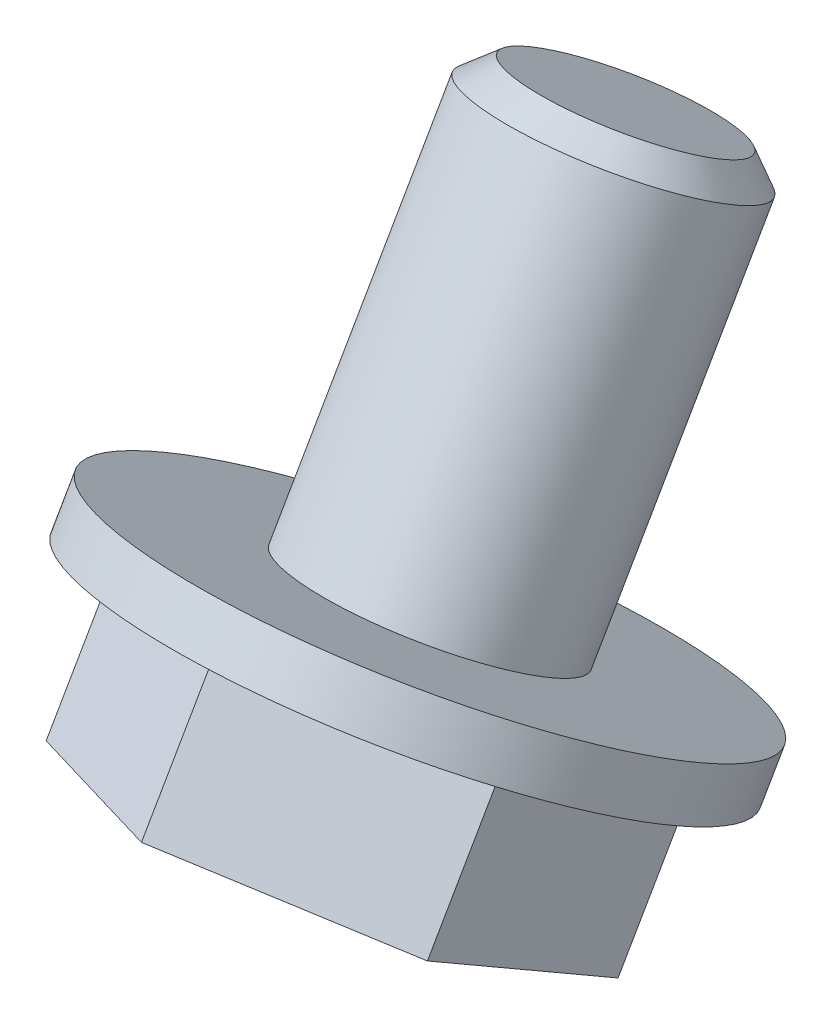
ISO-10303-21;
HEADER;
FILE_DESCRIPTION(('STEP AP214'),'2;1');
FILE_NAME('part.step','',(''),(''),'','','');
FILE_SCHEMA(('AUTOMOTIVE_DESIGN { 1 0 10303 214 1 1 1 1 }'));
ENDSEC;
DATA;
#1=APPLICATION_CONTEXT('core data for automotive mechanical design processes');
#2=APPLICATION_PROTOCOL_DEFINITION('international standard','automotive_design',2000,#1);
#3=PRODUCT_CONTEXT('',#1,'mechanical');
#4=PRODUCT('Part','Part','',(#3));
#5=PRODUCT_RELATED_PRODUCT_CATEGORY('part','',(#4));
#6=PRODUCT_DEFINITION_FORMATION('','',#4);
#7=PRODUCT_DEFINITION_CONTEXT('part definition',#1,'design');
#8=PRODUCT_DEFINITION('design','',#6,#7);
#9=PRODUCT_DEFINITION_SHAPE('','',#8);
#10=(LENGTH_UNIT() NAMED_UNIT(*) SI_UNIT(.MILLI.,.METRE.));
#11=(NAMED_UNIT(*) PLANE_ANGLE_UNIT() SI_UNIT($,.RADIAN.));
#12=(NAMED_UNIT(*) SI_UNIT($,.STERADIAN.) SOLID_ANGLE_UNIT());
#13=UNCERTAINTY_MEASURE_WITH_UNIT(LENGTH_MEASURE(1.E-05),#10,'distance_accuracy_value','');
#14=(GEOMETRIC_REPRESENTATION_CONTEXT(3) GLOBAL_UNCERTAINTY_ASSIGNED_CONTEXT((#13)) GLOBAL_UNIT_ASSIGNED_CONTEXT((#10,
#11,#12)) REPRESENTATION_CONTEXT('',''));
#15=CARTESIAN_POINT('',(0.,0.,0.));
#16=DIRECTION('',(0.,0.,1.));
#17=DIRECTION('',(1.,0.,0.));
#18=AXIS2_PLACEMENT_3D('',#15,#16,#17);
#19=CARTESIAN_POINT('',(-174.8681312178,-57.88145863115,30.14791531431));
#20=DIRECTION('',(0.,-0.866025403783768,0.500000000001161));
#21=DIRECTION('',(0.,0.500000000001161,0.866025403783768));
#22=AXIS2_PLACEMENT_3D('',#19,#20,#21);
#23=PLANE('',#22);
#24=DIRECTION('',(-1.,0.,0.));
#25=VECTOR('',#24,1.);
#26=CARTESIAN_POINT('',(-179.51530050145,-56.0116991146615,33.38643379479));
#27=LINE('',#26,#25);
#28=CARTESIAN_POINT('',(-178.60765025071,-56.0116991146643,33.3864337947881));
#29=VERTEX_POINT('',#28);
#30=CARTESIAN_POINT('',(-180.422950752151,-56.011699114664,33.386433794788));
#31=VERTEX_POINT('',#30);
#32=EDGE_CURVE('E167',#29,#31,#27,.T.);
#33=ORIENTED_EDGE('',*,*,#32,.T.);
#34=DIRECTION('',(0.,-0.500000000000399,-0.866025403784209));
#35=VECTOR('',#34,1.);
#36=CARTESIAN_POINT('',(-180.4229507522,-56.4655242400263,32.60038561991));
#37=LINE('',#36,#35);
#38=CARTESIAN_POINT('',(-180.422950752151,-56.9193493653849,31.8143374450396));
#39=VERTEX_POINT('',#38);
#40=EDGE_CURVE('E149',#31,#39,#37,.T.);
#41=ORIENTED_EDGE('',*,*,#40,.T.);
#42=DIRECTION('',(1.,0.,0.));
#43=VECTOR('',#42,1.);
#44=CARTESIAN_POINT('',(-179.51530050145,-56.9193493653813,31.81433744504));
#45=LINE('',#44,#43);
#46=CARTESIAN_POINT('',(-178.607650250716,-56.9193493653835,31.8143374450392));
#47=VERTEX_POINT('',#46);
#48=EDGE_CURVE('E155',#39,#47,#45,.T.);
#49=ORIENTED_EDGE('',*,*,#48,.T.);
#50=DIRECTION('',(0.,-0.500000000002688,-0.866025403782887));
#51=VECTOR('',#50,1.);
#52=CARTESIAN_POINT('',(-178.6076502507,-57.3731744907464,31.028289270165));
#53=LINE('',#52,#51);
#54=CARTESIAN_POINT('',(-178.607650250696,-57.8269996161055,30.2422410952936));
#55=VERTEX_POINT('',#54);
#56=EDGE_CURVE('E272',#47,#55,#53,.T.);
#57=ORIENTED_EDGE('',*,*,#56,.T.);
#58=DIRECTION('',(1.,0.,0.));
#59=VECTOR('',#58,1.);
#60=CARTESIAN_POINT('',(-177.7,-57.8269996161013,30.24224109529));
#61=LINE('',#60,#59);
#62=CARTESIAN_POINT('',(-176.792349749304,-57.8269996161055,30.2422410952936));
#63=VERTEX_POINT('',#62);
#64=EDGE_CURVE('E278',#55,#63,#61,.T.);
#65=ORIENTED_EDGE('',*,*,#64,.T.);
#66=DIRECTION('',(0.,0.500000000002688,0.866025403782887));
#67=VECTOR('',#66,1.);
#68=CARTESIAN_POINT('',(-176.7923497493,-57.3731744907464,31.028289270165));
#69=LINE('',#68,#67);
#70=CARTESIAN_POINT('',(-176.79234974929,-56.9193493653846,31.8143374450395));
#71=VERTEX_POINT('',#70);
#72=EDGE_CURVE('E284',#63,#71,#69,.T.);
#73=ORIENTED_EDGE('',*,*,#72,.T.);
#74=DIRECTION('',(1.,0.,0.));
#75=VECTOR('',#74,1.);
#76=CARTESIAN_POINT('',(-175.88469949855,-56.9193493653813,31.81433744504));
#77=LINE('',#76,#75);
#78=CARTESIAN_POINT('',(-174.97704924785,-56.9193493653849,31.8143374450395));
#79=VERTEX_POINT('',#78);
#80=EDGE_CURVE('E290',#71,#79,#77,.T.);
#81=ORIENTED_EDGE('',*,*,#80,.T.);
#82=DIRECTION('',(0.,0.500000000000399,0.866025403784209));
#83=VECTOR('',#82,1.);
#84=CARTESIAN_POINT('',(-174.9770492478,-56.4655242400263,32.60038561991));
#85=LINE('',#84,#83);
#86=CARTESIAN_POINT('',(-174.97704924785,-56.011699114664,33.3864337947879));
#87=VERTEX_POINT('',#86);
#88=EDGE_CURVE('E296',#79,#87,#85,.T.);
#89=ORIENTED_EDGE('',*,*,#88,.T.);
#90=DIRECTION('',(-1.,0.,0.));
#91=VECTOR('',#90,1.);
#92=CARTESIAN_POINT('',(-175.88469949855,-56.0116991146615,33.38643379479));
#93=LINE('',#92,#91);
#94=CARTESIAN_POINT('',(-176.79234974929,-56.0116991146643,33.386433794788));
#95=VERTEX_POINT('',#94);
#96=EDGE_CURVE('E302',#87,#95,#93,.T.);
#97=ORIENTED_EDGE('',*,*,#96,.T.);
#98=DIRECTION('',(0.,0.500000000000403,0.866025403784206));
#99=VECTOR('',#98,1.);
#100=CARTESIAN_POINT('',(-176.7923497493,-55.5578739893064,34.17248196966));
#101=LINE('',#100,#99);
#102=CARTESIAN_POINT('',(-176.792349749304,-55.1040488639459,34.9585301445339));
#103=VERTEX_POINT('',#102);
#104=EDGE_CURVE('E308',#95,#103,#101,.T.);
#105=ORIENTED_EDGE('',*,*,#104,.T.);
#106=DIRECTION('',(-1.,0.,0.));
#107=VECTOR('',#106,1.);
#108=CARTESIAN_POINT('',(-177.7,-55.1040488639514,34.95853014453));
#109=LINE('',#108,#107);
#110=CARTESIAN_POINT('',(-178.607650250696,-55.1040488639459,34.958530144534));
#111=VERTEX_POINT('',#110);
#112=EDGE_CURVE('E314',#103,#111,#109,.T.);
#113=ORIENTED_EDGE('',*,*,#112,.T.);
#114=DIRECTION('',(0.,-0.500000000000403,-0.866025403784206));
#115=VECTOR('',#114,1.);
#116=CARTESIAN_POINT('',(-178.6076502507,-55.5578739893064,34.17248196966));
#117=LINE('',#116,#115);
#118=EDGE_CURVE('E320',#111,#29,#117,.T.);
#119=ORIENTED_EDGE('',*,*,#118,.T.);
#120=EDGE_LOOP('',(#33,#41,#49,#57,#65,#73,#81,#89,#97,#105,#113,#119));
#121=FACE_BOUND('',#120,.T.);
#122=ADVANCED_FACE('F17',(#121),#23,.T.);
#123=CARTESIAN_POINT('',(-180.4592567622,-56.88470834923,31.79433744504));
#124=DIRECTION('',(0.,-0.500000000000343,-0.866025403784241));
#125=DIRECTION('',(1.,0.,0.));
#126=AXIS2_PLACEMENT_3D('',#123,#124,#125);
#127=PLANE('',#126);
#128=ORIENTED_EDGE('',*,*,#48,.F.);
#129=DIRECTION('',(0.,-0.866025403784242,0.50000000000034));
#130=VECTOR('',#129,1.);
#131=CARTESIAN_POINT('',(-180.4229507522,-57.7853747691705,32.3143374450352));
#132=LINE('',#131,#130);
#133=CARTESIAN_POINT('',(-180.422950752172,-58.6514001729502,32.814337445038));
#134=VERTEX_POINT('',#133);
#135=EDGE_CURVE('E158',#39,#134,#132,.T.);
#136=ORIENTED_EDGE('',*,*,#135,.T.);
#137=DIRECTION('',(-1.,0.,0.));
#138=VECTOR('',#137,1.);
#139=CARTESIAN_POINT('',(-177.7,-58.6514001729492,32.8143374450368));
#140=LINE('',#139,#138);
#141=CARTESIAN_POINT('',(-178.607650250719,-58.6514001729499,32.814337445038));
#142=VERTEX_POINT('',#141);
#143=EDGE_CURVE('E267',#142,#134,#140,.T.);
#144=ORIENTED_EDGE('',*,*,#143,.F.);
#145=DIRECTION('',(0.,0.866025403784239,-0.500000000000346));
#146=VECTOR('',#145,1.);
#147=CARTESIAN_POINT('',(-178.6076502507,-57.7853747691694,32.3143374450352));
#148=LINE('',#147,#146);
#149=EDGE_CURVE('E160',#142,#47,#148,.T.);
#150=ORIENTED_EDGE('',*,*,#149,.T.);
#151=EDGE_LOOP('',(#128,#136,#144,#150));
#152=FACE_BOUND('',#151,.T.);
#153=ADVANCED_FACE('F156',(#152),#127,.F.);
#154=CARTESIAN_POINT('',(-180.4229507522,-55.9589050935,33.39787572178));
#155=DIRECTION('',(-1.,0.,0.));
#156=DIRECTION('',(0.,-0.500000000000399,-0.866025403784209));
#157=AXIS2_PLACEMENT_3D('',#154,#155,#156);
#158=PLANE('',#157);
#159=ORIENTED_EDGE('',*,*,#40,.F.);
#160=DIRECTION('',(0.,-0.866025403785443,0.49999999999826));
#161=VECTOR('',#160,1.);
#162=CARTESIAN_POINT('',(-180.422950752171,-56.87772451845,33.88643379479));
#163=LINE('',#162,#161);
#164=CARTESIAN_POINT('',(-180.42295075218,-57.7437499222339,34.3864337947858));
#165=VERTEX_POINT('',#164);
#166=EDGE_CURVE('E322',#31,#165,#163,.T.);
#167=ORIENTED_EDGE('',*,*,#166,.T.);
#168=DIRECTION('',(0.,0.500000000000107,0.866025403784377));
#169=VECTOR('',#168,1.);
#170=CARTESIAN_POINT('',(-180.422950752147,-58.19757504759,33.60038561991));
#171=LINE('',#170,#169);
#172=EDGE_CURVE('E166',#134,#165,#171,.T.);
#173=ORIENTED_EDGE('',*,*,#172,.F.);
#174=ORIENTED_EDGE('',*,*,#135,.F.);
#175=EDGE_LOOP('',(#159,#167,#173,#174));
#176=FACE_BOUND('',#175,.T.);
#177=ADVANCED_FACE('F165',(#176),#158,.F.);
#178=CARTESIAN_POINT('',(-178.5713442407,-55.97705809851,33.36643379479));
#179=DIRECTION('',(0.,0.499999999998258,0.866025403785444));
#180=DIRECTION('',(-1.,0.,0.));
#181=AXIS2_PLACEMENT_3D('',#178,#179,#180);
#182=PLANE('',#181);
#183=ORIENTED_EDGE('',*,*,#32,.F.);
#184=DIRECTION('',(0.,-0.866025403784241,0.500000000000343));
#185=VECTOR('',#184,1.);
#186=CARTESIAN_POINT('',(-178.6076502507,-56.8777245184505,33.8864337947852));
#187=LINE('',#186,#185);
#188=CARTESIAN_POINT('',(-178.607650250719,-57.7437499222355,34.3864337947871));
#189=VERTEX_POINT('',#188);
#190=EDGE_CURVE('E317',#29,#189,#187,.T.);
#191=ORIENTED_EDGE('',*,*,#190,.T.);
#192=DIRECTION('',(1.,0.,0.));
#193=VECTOR('',#192,1.);
#194=CARTESIAN_POINT('',(-177.7,-57.7437499222308,34.3864337947832));
#195=LINE('',#194,#193);
#196=EDGE_CURVE('E264',#165,#189,#195,.T.);
#197=ORIENTED_EDGE('',*,*,#196,.F.);
#198=ORIENTED_EDGE('',*,*,#166,.F.);
#199=EDGE_LOOP('',(#183,#191,#197,#198));
#200=FACE_BOUND('',#199,.T.);
#201=ADVANCED_FACE('F325',(#200),#182,.F.);
#202=CARTESIAN_POINT('',(-178.6076502507,-55.05125484278,34.96997207153));
#203=DIRECTION('',(-1.,0.,0.));
#204=DIRECTION('',(0.,-0.5000000000004,-0.866025403784208));
#205=AXIS2_PLACEMENT_3D('',#202,#203,#204);
#206=PLANE('',#205);
#207=ORIENTED_EDGE('',*,*,#118,.F.);
#208=DIRECTION('',(0.,-0.866025403784237,0.500000000000349));
#209=VECTOR('',#208,1.);
#210=CARTESIAN_POINT('',(-178.607650250673,-55.970074267735,35.45853014453));
#211=LINE('',#210,#209);
#212=CARTESIAN_POINT('',(-178.607650250697,-56.8360996715143,35.9585301445324));
#213=VERTEX_POINT('',#212);
#214=EDGE_CURVE('E311',#111,#213,#211,.T.);
#215=ORIENTED_EDGE('',*,*,#214,.T.);
#216=DIRECTION('',(0.,0.500000000000107,0.866025403784377));
#217=VECTOR('',#216,1.);
#218=CARTESIAN_POINT('',(-178.607650250716,-58.19757504759,33.60038561991));
#219=LINE('',#218,#217);
#220=EDGE_CURVE('E262',#189,#213,#219,.T.);
#221=ORIENTED_EDGE('',*,*,#220,.F.);
#222=ORIENTED_EDGE('',*,*,#190,.F.);
#223=EDGE_LOOP('',(#207,#215,#221,#222));
#224=FACE_BOUND('',#223,.T.);
#225=ADVANCED_FACE('F362',(#224),#206,.F.);
#226=CARTESIAN_POINT('',(-176.7560437393,-55.0694078478,34.93853014453));
#227=DIRECTION('',(0.,0.500000000000349,0.866025403784237));
#228=DIRECTION('',(-1.,0.,0.));
#229=AXIS2_PLACEMENT_3D('',#226,#227,#228);
#230=PLANE('',#229);
#231=ORIENTED_EDGE('',*,*,#112,.F.);
#232=DIRECTION('',(0.,-0.866025403784241,0.500000000000342));
#233=VECTOR('',#232,1.);
#234=CARTESIAN_POINT('',(-176.7923497493,-55.9700742677296,35.4585301445348));
#235=LINE('',#234,#233);
#236=CARTESIAN_POINT('',(-176.792349749309,-56.8360996715158,35.958530144531));
#237=VERTEX_POINT('',#236);
#238=EDGE_CURVE('E305',#103,#237,#235,.T.);
#239=ORIENTED_EDGE('',*,*,#238,.T.);
#240=DIRECTION('',(1.,0.,0.));
#241=VECTOR('',#240,1.);
#242=CARTESIAN_POINT('',(-177.7,-56.8360996715125,35.9585301445295));
#243=LINE('',#242,#241);
#244=EDGE_CURVE('E260',#213,#237,#243,.T.);
#245=ORIENTED_EDGE('',*,*,#244,.F.);
#246=ORIENTED_EDGE('',*,*,#214,.F.);
#247=EDGE_LOOP('',(#231,#239,#245,#246));
#248=FACE_BOUND('',#247,.T.);
#249=ADVANCED_FACE('F359',(#248),#230,.F.);
#250=CARTESIAN_POINT('',(-176.7923497493,-55.99521110353,33.33499186779));
#251=DIRECTION('',(1.,0.,0.));
#252=DIRECTION('',(0.,0.5000000000004,0.866025403784208));
#253=AXIS2_PLACEMENT_3D('',#250,#251,#252);
#254=PLANE('',#253);
#255=ORIENTED_EDGE('',*,*,#104,.F.);
#256=DIRECTION('',(0.,-0.866025403785443,0.49999999999826));
#257=VECTOR('',#256,1.);
#258=CARTESIAN_POINT('',(-176.792349749271,-56.87772451845,33.88643379479));
#259=LINE('',#258,#257);
#260=CARTESIAN_POINT('',(-176.792349749289,-57.7437499222344,34.3864337947858));
#261=VERTEX_POINT('',#260);
#262=EDGE_CURVE('E299',#95,#261,#259,.T.);
#263=ORIENTED_EDGE('',*,*,#262,.T.);
#264=DIRECTION('',(0.,-0.500000000000108,-0.866025403784377));
#265=VECTOR('',#264,1.);
#266=CARTESIAN_POINT('',(-176.792349749284,-58.19757504759,33.60038561991));
#267=LINE('',#266,#265);
#268=EDGE_CURVE('E258',#237,#261,#267,.T.);
#269=ORIENTED_EDGE('',*,*,#268,.F.);
#270=ORIENTED_EDGE('',*,*,#238,.F.);
#271=EDGE_LOOP('',(#255,#263,#269,#270));
#272=FACE_BOUND('',#271,.T.);
#273=ADVANCED_FACE('F355',(#272),#254,.F.);
#274=CARTESIAN_POINT('',(-174.9407432378,-55.97705809851,33.36643379479));
#275=DIRECTION('',(0.,0.499999999998258,0.866025403785444));
#276=DIRECTION('',(-1.,0.,0.));
#277=AXIS2_PLACEMENT_3D('',#274,#275,#276);
#278=PLANE('',#277);
#279=ORIENTED_EDGE('',*,*,#96,.F.);
#280=DIRECTION('',(0.,-0.866025403784244,0.500000000000337));
#281=VECTOR('',#280,1.);
#282=CARTESIAN_POINT('',(-174.9770492478,-56.8777245184496,33.8864337947848));
#283=LINE('',#282,#281);
#284=CARTESIAN_POINT('',(-174.977049247827,-57.7437499222352,34.386433794787));
#285=VERTEX_POINT('',#284);
#286=EDGE_CURVE('E293',#87,#285,#283,.T.);
#287=ORIENTED_EDGE('',*,*,#286,.T.);
#288=DIRECTION('',(1.,0.,0.));
#289=VECTOR('',#288,1.);
#290=CARTESIAN_POINT('',(-177.7,-57.7437499222308,34.3864337947832));
#291=LINE('',#290,#289);
#292=EDGE_CURVE('E256',#261,#285,#291,.T.);
#293=ORIENTED_EDGE('',*,*,#292,.F.);
#294=ORIENTED_EDGE('',*,*,#262,.F.);
#295=EDGE_LOOP('',(#279,#287,#293,#294));
#296=FACE_BOUND('',#295,.T.);
#297=ADVANCED_FACE('F351',(#296),#278,.F.);
#298=CARTESIAN_POINT('',(-174.9770492478,-56.90286135425,31.76289551804));
#299=DIRECTION('',(1.,0.,0.));
#300=DIRECTION('',(0.,0.500000000000399,0.866025403784209));
#301=AXIS2_PLACEMENT_3D('',#298,#299,#300);
#302=PLANE('',#301);
#303=ORIENTED_EDGE('',*,*,#88,.F.);
#304=DIRECTION('',(0.,-0.866025403784241,0.500000000000343));
#305=VECTOR('',#304,1.);
#306=CARTESIAN_POINT('',(-174.977049247829,-57.785374769165,32.31433744504));
#307=LINE('',#306,#305);
#308=CARTESIAN_POINT('',(-174.977049247821,-58.6514001729516,32.8143374450367));
#309=VERTEX_POINT('',#308);
#310=EDGE_CURVE('E287',#79,#309,#307,.T.);
#311=ORIENTED_EDGE('',*,*,#310,.T.);
#312=DIRECTION('',(0.,-0.500000000000107,-0.866025403784377));
#313=VECTOR('',#312,1.);
#314=CARTESIAN_POINT('',(-174.977049247853,-58.19757504759,33.60038561991));
#315=LINE('',#314,#313);
#316=EDGE_CURVE('E254',#285,#309,#315,.T.);
#317=ORIENTED_EDGE('',*,*,#316,.F.);
#318=ORIENTED_EDGE('',*,*,#286,.F.);
#319=EDGE_LOOP('',(#303,#311,#317,#318));
#320=FACE_BOUND('',#319,.T.);
#321=ADVANCED_FACE('F347',(#320),#302,.F.);
#322=CARTESIAN_POINT('',(-176.8286557593,-56.88470834923,31.79433744504));
#323=DIRECTION('',(0.,-0.500000000000343,-0.866025403784241));
#324=DIRECTION('',(1.,0.,0.));
#325=AXIS2_PLACEMENT_3D('',#322,#323,#324);
#326=PLANE('',#325);
#327=ORIENTED_EDGE('',*,*,#80,.F.);
#328=DIRECTION('',(0.,-0.866025403784241,0.500000000000343));
#329=VECTOR('',#328,1.);
#330=CARTESIAN_POINT('',(-176.7923497493,-57.7853747691695,32.314337445035));
#331=LINE('',#330,#329);
#332=CARTESIAN_POINT('',(-176.792349749281,-58.6514001729499,32.8143374450379));
#333=VERTEX_POINT('',#332);
#334=EDGE_CURVE('E281',#71,#333,#331,.T.);
#335=ORIENTED_EDGE('',*,*,#334,.T.);
#336=DIRECTION('',(-1.,0.,0.));
#337=VECTOR('',#336,1.);
#338=CARTESIAN_POINT('',(-177.7,-58.6514001729492,32.8143374450368));
#339=LINE('',#338,#337);
#340=EDGE_CURVE('E252',#309,#333,#339,.T.);
#341=ORIENTED_EDGE('',*,*,#340,.F.);
#342=ORIENTED_EDGE('',*,*,#310,.F.);
#343=EDGE_LOOP('',(#327,#335,#341,#342));
#344=FACE_BOUND('',#343,.T.);
#345=ADVANCED_FACE('F343',(#344),#326,.F.);
#346=CARTESIAN_POINT('',(-176.7923497493,-57.81051160497,30.1907991683));
#347=DIRECTION('',(1.,0.,0.));
#348=DIRECTION('',(0.,0.50000000000269,0.866025403782885));
#349=AXIS2_PLACEMENT_3D('',#346,#347,#348);
#350=PLANE('',#349);
#351=ORIENTED_EDGE('',*,*,#72,.F.);
#352=DIRECTION('',(0.,-0.866025403784244,0.500000000000337));
#353=VECTOR('',#352,1.);
#354=CARTESIAN_POINT('',(-176.792349749327,-58.693025019885,30.74224109529));
#355=LINE('',#354,#353);
#356=CARTESIAN_POINT('',(-176.792349749303,-59.5590504236712,31.2422410952926));
#357=VERTEX_POINT('',#356);
#358=EDGE_CURVE('E275',#63,#357,#355,.T.);
#359=ORIENTED_EDGE('',*,*,#358,.T.);
#360=DIRECTION('',(0.,-0.500000000000108,-0.866025403784377));
#361=VECTOR('',#360,1.);
#362=CARTESIAN_POINT('',(-176.792349749284,-58.19757504759,33.60038561991));
#363=LINE('',#362,#361);
#364=EDGE_CURVE('E250',#333,#357,#363,.T.);
#365=ORIENTED_EDGE('',*,*,#364,.F.);
#366=ORIENTED_EDGE('',*,*,#334,.F.);
#367=EDGE_LOOP('',(#351,#359,#365,#366));
#368=FACE_BOUND('',#367,.T.);
#369=ADVANCED_FACE('F339',(#368),#350,.F.);
#370=CARTESIAN_POINT('',(-178.6439562607,-57.79235859995,30.22224109529));
#371=DIRECTION('',(0.,-0.500000000000337,-0.866025403784244));
#372=DIRECTION('',(1.,0.,0.));
#373=AXIS2_PLACEMENT_3D('',#370,#371,#372);
#374=PLANE('',#373);
#375=ORIENTED_EDGE('',*,*,#64,.F.);
#376=DIRECTION('',(0.,-0.86602540378424,0.500000000000344));
#377=VECTOR('',#376,1.);
#378=CARTESIAN_POINT('',(-178.6076502507,-58.6930250198905,30.7422410952951));
#379=LINE('',#378,#377);
#380=CARTESIAN_POINT('',(-178.607650250691,-59.5590504236697,31.2422410952914));
#381=VERTEX_POINT('',#380);
#382=EDGE_CURVE('E269',#55,#381,#379,.T.);
#383=ORIENTED_EDGE('',*,*,#382,.T.);
#384=DIRECTION('',(-1.,0.,0.));
#385=VECTOR('',#384,1.);
#386=CARTESIAN_POINT('',(-177.7,-59.5590504236675,31.2422410952905));
#387=LINE('',#386,#385);
#388=EDGE_CURVE('E248',#357,#381,#387,.T.);
#389=ORIENTED_EDGE('',*,*,#388,.F.);
#390=ORIENTED_EDGE('',*,*,#358,.F.);
#391=EDGE_LOOP('',(#375,#383,#389,#390));
#392=FACE_BOUND('',#391,.T.);
#393=ADVANCED_FACE('F336',(#392),#374,.F.);
#394=CARTESIAN_POINT('',(-178.6076502507,-56.86655534422,31.82577937203));
#395=DIRECTION('',(-1.,0.,0.));
#396=DIRECTION('',(0.,-0.50000000000269,-0.866025403782885));
#397=AXIS2_PLACEMENT_3D('',#394,#395,#396);
#398=PLANE('',#397);
#399=ORIENTED_EDGE('',*,*,#56,.F.);
#400=ORIENTED_EDGE('',*,*,#149,.F.);
#401=DIRECTION('',(0.,0.500000000000107,0.866025403784377));
#402=VECTOR('',#401,1.);
#403=CARTESIAN_POINT('',(-178.607650250716,-58.19757504759,33.60038561991));
#404=LINE('',#403,#402);
#405=EDGE_CURVE('E245',#381,#142,#404,.T.);
#406=ORIENTED_EDGE('',*,*,#405,.F.);
#407=ORIENTED_EDGE('',*,*,#382,.F.);
#408=EDGE_LOOP('',(#399,#400,#406,#407));
#409=FACE_BOUND('',#408,.T.);
#410=ADVANCED_FACE('F333',(#409),#398,.F.);
#411=CARTESIAN_POINT('',(-173.6470011103,-60.53757504759,29.5473867302));
#412=DIRECTION('',(0.,-0.866025403784377,0.500000000000107));
#413=DIRECTION('',(0.,0.500000000000107,0.866025403784377));
#414=AXIS2_PLACEMENT_3D('',#411,#412,#413);
#415=PLANE('',#414);
#416=ORIENTED_EDGE('',*,*,#388,.T.);
#417=ORIENTED_EDGE('',*,*,#405,.T.);
#418=ORIENTED_EDGE('',*,*,#143,.T.);
#419=ORIENTED_EDGE('',*,*,#172,.T.);
#420=ORIENTED_EDGE('',*,*,#196,.T.);
#421=ORIENTED_EDGE('',*,*,#220,.T.);
#422=ORIENTED_EDGE('',*,*,#244,.T.);
#423=ORIENTED_EDGE('',*,*,#268,.T.);
#424=ORIENTED_EDGE('',*,*,#292,.T.);
#425=ORIENTED_EDGE('',*,*,#316,.T.);
#426=ORIENTED_EDGE('',*,*,#340,.T.);
#427=ORIENTED_EDGE('',*,*,#364,.T.);
#428=EDGE_LOOP('',(#416,#417,#418,#419,#420,#421,#422,#423,#424,#425,#426,#427));
#429=FACE_BOUND('',#428,.T.);
#430=DIRECTION('',(0.86602540378429,0.250000000000646,0.433012701892144));
#431=VECTOR('',#430,1.);
#432=CARTESIAN_POINT('',(-179.64855715855,-56.5100750475929,36.523221357685));
#433=LINE('',#432,#431);
#434=CARTESIAN_POINT('',(-181.59711431702,-57.0725750475922,35.5489427784283));
#435=VERTEX_POINT('',#434);
#436=CARTESIAN_POINT('',(-177.699999999885,-55.9475750476282,37.497499936877));
#437=VERTEX_POINT('',#436);
#438=EDGE_CURVE('E192',#435,#437,#433,.T.);
#439=ORIENTED_EDGE('',*,*,#438,.F.);
#440=DIRECTION('',(0.,0.50000000000011,0.866025403784375));
#441=VECTOR('',#440,1.);
#442=CARTESIAN_POINT('',(-181.597114317,-58.1975750475929,33.600385619915));
#443=LINE('',#442,#441);
#444=CARTESIAN_POINT('',(-181.597114317035,-59.3225750475922,31.6518284613988));
#445=VERTEX_POINT('',#444);
#446=EDGE_CURVE('E184',#445,#435,#443,.T.);
#447=ORIENTED_EDGE('',*,*,#446,.F.);
#448=DIRECTION('',(-0.86602540378349,0.250000000000411,0.43301270189388));
#449=VECTOR('',#448,1.);
#450=CARTESIAN_POINT('',(-179.64855715855,-59.8850750475929,30.67754988214));
#451=LINE('',#450,#449);
#452=CARTESIAN_POINT('',(-177.70000000025,-60.4475750475193,29.7032713030057));
#453=VERTEX_POINT('',#452);
#454=EDGE_CURVE('E185',#453,#445,#451,.T.);
#455=ORIENTED_EDGE('',*,*,#454,.F.);
#456=DIRECTION('',(-0.866025403783489,-0.250000000000413,-0.433012701893882));
#457=VECTOR('',#456,1.);
#458=CARTESIAN_POINT('',(-175.75144284145,-59.8850750475929,30.67754988214));
#459=LINE('',#458,#457);
#460=CARTESIAN_POINT('',(-173.802885682981,-59.3225750475922,31.6518284613991));
#461=VERTEX_POINT('',#460);
#462=EDGE_CURVE('E61',#461,#453,#459,.T.);
#463=ORIENTED_EDGE('',*,*,#462,.F.);
#464=DIRECTION('',(0.,-0.50000000000011,-0.866025403784375));
#465=VECTOR('',#464,1.);
#466=CARTESIAN_POINT('',(-173.802885683,-58.1975750475929,33.600385619915));
#467=LINE('',#466,#465);
#468=CARTESIAN_POINT('',(-173.802885682965,-57.0725750475922,35.5489427784286));
#469=VERTEX_POINT('',#468);
#470=EDGE_CURVE('E179',#469,#461,#467,.T.);
#471=ORIENTED_EDGE('',*,*,#470,.F.);
#472=DIRECTION('',(0.866025403784288,-0.250000000000648,-0.433012701892146));
#473=VECTOR('',#472,1.);
#474=CARTESIAN_POINT('',(-175.75144284145,-56.5100750475929,36.523221357685));
#475=LINE('',#474,#473);
#476=EDGE_CURVE('E196',#437,#469,#475,.T.);
#477=ORIENTED_EDGE('',*,*,#476,.F.);
#478=EDGE_LOOP('',(#439,#447,#455,#463,#471,#477));
#479=FACE_BOUND('',#478,.T.);
#480=ADVANCED_FACE('F238',(#429,#479),#415,.T.);
#481=CARTESIAN_POINT('',(-181.6750566034,-56.65003731201,30.16079960457));
#482=DIRECTION('',(-0.500000000001645,-0.433012701891437,-0.749999999999355));
#483=DIRECTION('',(0.866025403783489,-0.250000000000417,-0.433012701893879));
#484=AXIS2_PLACEMENT_3D('',#481,#482,#483);
#485=PLANE('',#484);
#486=ORIENTED_EDGE('',*,*,#454,.T.);
#487=DIRECTION('',(0.,-0.866025403784643,0.499999999999646));
#488=VECTOR('',#487,1.);
#489=CARTESIAN_POINT('',(-181.597114317,-58.023536941915,30.9018284614006));
#490=LINE('',#489,#488);
#491=CARTESIAN_POINT('',(-181.597114317017,-56.7244988362405,30.151828461393));
#492=VERTEX_POINT('',#491);
#493=EDGE_CURVE('E181',#492,#445,#490,.T.);
#494=ORIENTED_EDGE('',*,*,#493,.F.);
#495=DIRECTION('',(-0.866025403784341,0.249999999999971,0.433012701892432));
#496=VECTOR('',#495,1.);
#497=CARTESIAN_POINT('',(-177.7,-57.84949883624,28.2032713028776));
#498=LINE('',#497,#496);
#499=CARTESIAN_POINT('',(-177.699999999982,-57.8494988362372,28.2032713028824));
#500=VERTEX_POINT('',#499);
#501=EDGE_CURVE('E21',#500,#492,#498,.T.);
#502=ORIENTED_EDGE('',*,*,#501,.F.);
#503=DIRECTION('',(0.,0.866025403784641,-0.499999999999649));
#504=VECTOR('',#503,1.);
#505=CARTESIAN_POINT('',(-177.699999999959,-59.148536941915,28.9532713028804));
#506=LINE('',#505,#504);
#507=EDGE_CURVE('E55',#453,#500,#506,.T.);
#508=ORIENTED_EDGE('',*,*,#507,.F.);
#509=EDGE_LOOP('',(#486,#494,#502,#508));
#510=FACE_BOUND('',#509,.T.);
#511=ADVANCED_FACE('F233',(#510),#485,.T.);
#512=CARTESIAN_POINT('',(-181.597114317,-54.37753731201,34.09688506477));
#513=DIRECTION('',(-1.,0.,0.));
#514=DIRECTION('',(0.,-0.50000000000011,-0.866025403784375));
#515=AXIS2_PLACEMENT_3D('',#512,#513,#514);
#516=PLANE('',#515);
#517=ORIENTED_EDGE('',*,*,#446,.T.);
#518=DIRECTION('',(0.,-0.866025403784644,0.499999999999645));
#519=VECTOR('',#518,1.);
#520=CARTESIAN_POINT('',(-181.597114317059,-55.773536941915,34.7989427784302));
#521=LINE('',#520,#519);
#522=CARTESIAN_POINT('',(-181.597114317042,-54.4744988362409,34.0489427784248));
#523=VERTEX_POINT('',#522);
#524=EDGE_CURVE('E189',#523,#435,#521,.T.);
#525=ORIENTED_EDGE('',*,*,#524,.F.);
#526=DIRECTION('',(0.,0.499999999999772,0.86602540378457));
#527=VECTOR('',#526,1.);
#528=CARTESIAN_POINT('',(-181.59711431703,-55.59949883624,32.10038561991));
#529=LINE('',#528,#527);
#530=EDGE_CURVE('E186',#492,#523,#529,.T.);
#531=ORIENTED_EDGE('',*,*,#530,.F.);
#532=ORIENTED_EDGE('',*,*,#493,.T.);
#533=EDGE_LOOP('',(#517,#525,#531,#532));
#534=FACE_BOUND('',#533,.T.);
#535=ADVANCED_FACE('F236',(#534),#516,.T.);
#536=CARTESIAN_POINT('',(-177.6220577137,-53.27503731201,36.00647108011));
#537=DIRECTION('',(-0.500000000000259,0.433012701891836,0.750000000000049));
#538=DIRECTION('',(-0.866025403784289,-0.250000000000648,-0.433012701892145));
#539=AXIS2_PLACEMENT_3D('',#536,#537,#538);
#540=PLANE('',#539);
#541=ORIENTED_EDGE('',*,*,#438,.T.);
#542=DIRECTION('',(0.,-0.866025403784643,0.499999999999645));
#543=VECTOR('',#542,1.);
#544=CARTESIAN_POINT('',(-177.699999999959,-54.648536941915,36.7474999369398));
#545=LINE('',#544,#543);
#546=CARTESIAN_POINT('',(-177.699999999982,-53.3494988362423,35.9974999369383));
#547=VERTEX_POINT('',#546);
#548=EDGE_CURVE('E193',#547,#437,#545,.T.);
#549=ORIENTED_EDGE('',*,*,#548,.F.);
#550=DIRECTION('',(0.866025403784341,0.249999999999971,0.433012701892432));
#551=VECTOR('',#550,1.);
#552=CARTESIAN_POINT('',(-181.59711431703,-54.47449883624,34.0489427784261));
#553=LINE('',#552,#551);
#554=EDGE_CURVE('E188',#523,#547,#553,.T.);
#555=ORIENTED_EDGE('',*,*,#554,.F.);
#556=ORIENTED_EDGE('',*,*,#524,.T.);
#557=EDGE_LOOP('',(#541,#549,#555,#556));
#558=FACE_BOUND('',#557,.T.);
#559=ADVANCED_FACE('F221',(#558),#540,.T.);
#560=CARTESIAN_POINT('',(-173.7249433966,-54.44503731201,33.97997163526));
#561=DIRECTION('',(0.500000000000262,0.433012701891837,0.750000000000046));
#562=DIRECTION('',(-0.866025403784288,0.250000000000649,0.433012701892147));
#563=AXIS2_PLACEMENT_3D('',#560,#561,#562);
#564=PLANE('',#563);
#565=ORIENTED_EDGE('',*,*,#476,.T.);
#566=DIRECTION('',(0.,-0.866025403784642,0.499999999999648));
#567=VECTOR('',#566,1.);
#568=CARTESIAN_POINT('',(-173.802885683,-55.773536941915,34.7989427784294));
#569=LINE('',#568,#567);
#570=CARTESIAN_POINT('',(-173.802885682984,-54.4744988362377,34.0489427784302));
#571=VERTEX_POINT('',#570);
#572=EDGE_CURVE('E197',#571,#469,#569,.T.);
#573=ORIENTED_EDGE('',*,*,#572,.F.);
#574=DIRECTION('',(0.866025403784343,-0.249999999999969,-0.433012701892429));
#575=VECTOR('',#574,1.);
#576=CARTESIAN_POINT('',(-177.7,-53.34949883624,35.9974999369424));
#577=LINE('',#576,#575);
#578=EDGE_CURVE('E176',#547,#571,#577,.T.);
#579=ORIENTED_EDGE('',*,*,#578,.F.);
#580=ORIENTED_EDGE('',*,*,#548,.T.);
#581=EDGE_LOOP('',(#565,#573,#579,#580));
#582=FACE_BOUND('',#581,.T.);
#583=ADVANCED_FACE('F225',(#582),#564,.T.);
#584=CARTESIAN_POINT('',(-173.802885683,-56.71753731201,30.04388617506));
#585=DIRECTION('',(1.,0.,0.));
#586=DIRECTION('',(0.,0.50000000000011,0.866025403784375));
#587=AXIS2_PLACEMENT_3D('',#584,#585,#586);
#588=PLANE('',#587);
#589=ORIENTED_EDGE('',*,*,#470,.T.);
#590=DIRECTION('',(0.,-0.866025403784643,0.499999999999645));
#591=VECTOR('',#590,1.);
#592=CARTESIAN_POINT('',(-173.802885682941,-58.023536941915,30.9018284613996));
#593=LINE('',#592,#591);
#594=CARTESIAN_POINT('',(-173.802885682957,-56.7244988362374,30.1518284613984));
#595=VERTEX_POINT('',#594);
#596=EDGE_CURVE('E177',#595,#461,#593,.T.);
#597=ORIENTED_EDGE('',*,*,#596,.F.);
#598=DIRECTION('',(0.,-0.499999999999772,-0.866025403784571));
#599=VECTOR('',#598,1.);
#600=CARTESIAN_POINT('',(-173.80288568297,-55.59949883624,32.10038561991));
#601=LINE('',#600,#599);
#602=EDGE_CURVE('E36',#571,#595,#601,.T.);
#603=ORIENTED_EDGE('',*,*,#602,.F.);
#604=ORIENTED_EDGE('',*,*,#572,.T.);
#605=EDGE_LOOP('',(#589,#597,#603,#604));
#606=FACE_BOUND('',#605,.T.);
#607=ADVANCED_FACE('F228',(#606),#588,.T.);
#608=CARTESIAN_POINT('',(-177.7779422863,-57.82003731201,28.13430015971));
#609=DIRECTION('',(0.500000000001648,-0.433012701891439,-0.749999999999352));
#610=DIRECTION('',(0.866025403783487,0.250000000000418,0.433012701893881));
#611=AXIS2_PLACEMENT_3D('',#608,#609,#610);
#612=PLANE('',#611);
#613=ORIENTED_EDGE('',*,*,#462,.T.);
#614=ORIENTED_EDGE('',*,*,#507,.T.);
#615=DIRECTION('',(-0.866025403784342,-0.249999999999969,-0.43301270189243));
#616=VECTOR('',#615,1.);
#617=CARTESIAN_POINT('',(-173.80288568297,-56.72449883624,30.1518284613938));
#618=LINE('',#617,#616);
#619=EDGE_CURVE('E175',#595,#500,#618,.T.);
#620=ORIENTED_EDGE('',*,*,#619,.F.);
#621=ORIENTED_EDGE('',*,*,#596,.T.);
#622=EDGE_LOOP('',(#613,#614,#620,#621));
#623=FACE_BOUND('',#622,.T.);
#624=ADVANCED_FACE('F229',(#623),#612,.T.);
#625=CARTESIAN_POINT('',(-175.62,-48.84527019373,25.79905279468));
#626=DIRECTION('',(0.,0.866025403783744,-0.500000000001204));
#627=DIRECTION('',(-1.,0.,0.));
#628=AXIS2_PLACEMENT_3D('',#625,#626,#627);
#629=PLANE('',#628);
#630=CARTESIAN_POINT('',(-177.700000000008,-47.8052702021825,27.6003856199057));
#631=DIRECTION('',(0.,0.866025403783744,-0.500000000001204));
#632=DIRECTION('',(0.,0.500000000001204,0.866025403783744));
#633=AXIS2_PLACEMENT_3D('',#630,#631,#632);
#634=CIRCLE('',#633,1.9999959882734);
#635=CARTESIAN_POINT('',(-177.700000000008,-46.8052722080434,29.332432953216));
#636=VERTEX_POINT('',#635);
#637=EDGE_CURVE('E208',#636,#636,#634,.T.);
#638=ORIENTED_EDGE('',*,*,#637,.T.);
#639=EDGE_LOOP('',(#638));
#640=FACE_BOUND('',#639,.T.);
#641=ADVANCED_FACE('F515',(#640),#629,.T.);
#642=CARTESIAN_POINT('',(-171.98,-58.45949883624,27.14672031026));
#643=DIRECTION('',(0.,-0.86602540378457,0.499999999999772));
#644=DIRECTION('',(0.,0.499999999999772,0.86602540378457));
#645=AXIS2_PLACEMENT_3D('',#642,#643,#644);
#646=PLANE('',#645);
#647=ORIENTED_EDGE('',*,*,#602,.T.);
#648=ORIENTED_EDGE('',*,*,#619,.T.);
#649=ORIENTED_EDGE('',*,*,#501,.T.);
#650=ORIENTED_EDGE('',*,*,#530,.T.);
#651=ORIENTED_EDGE('',*,*,#554,.T.);
#652=ORIENTED_EDGE('',*,*,#578,.T.);
#653=EDGE_LOOP('',(#647,#648,#649,#650,#651,#652));
#654=FACE_BOUND('',#653,.T.);
#655=CARTESIAN_POINT('',(-177.7,-55.5994988362489,32.1003856199151));
#656=DIRECTION('',(0.,-0.866025403783334,0.500000000001914));
#657=DIRECTION('',(0.,-0.500000000001914,-0.866025403783334));
#658=AXIS2_PLACEMENT_3D('',#655,#656,#657);
#659=CIRCLE('',#658,5.50000000000303);
#660=CARTESIAN_POINT('',(-177.7,-58.3494988362609,27.3372458991041));
#661=VERTEX_POINT('',#660);
#662=EDGE_CURVE('E205',#661,#661,#659,.T.);
#663=ORIENTED_EDGE('',*,*,#662,.T.);
#664=EDGE_LOOP('',(#663));
#665=FACE_BOUND('',#664,.T.);
#666=ADVANCED_FACE('F214',(#654,#665),#646,.T.);
#667=CARTESIAN_POINT('',(-177.7,-47.8052719392831,27.6003866228212));
#668=DIRECTION('',(0.,-0.866025403785829,0.499999999997592));
#669=DIRECTION('',(0.,-0.499999999997592,-0.866025403785829));
#670=AXIS2_PLACEMENT_3D('',#667,#668,#669);
#671=CONICAL_SURFACE('',#670,1.99999799410041,0.785397160377723);
#672=CARTESIAN_POINT('',(-177.7,-48.238287246981,27.8503881272822));
#673=DIRECTION('',(0.,-0.866025403785829,0.499999999997592));
#674=DIRECTION('',(0.,-0.499999999997592,-0.866025403785829));
#675=AXIS2_PLACEMENT_3D('',#672,#673,#674);
#676=CIRCLE('',#675,2.5);
#677=CARTESIAN_POINT('',(-177.7,-46.9882872469745,30.0154516367684));
#678=VERTEX_POINT('',#677);
#679=EDGE_CURVE('E202',#678,#678,#676,.F.);
#680=ORIENTED_EDGE('',*,*,#679,.T.);
#681=EDGE_LOOP('',(#680));
#682=FACE_BOUND('',#681,.T.);
#683=ORIENTED_EDGE('',*,*,#637,.F.);
#684=EDGE_LOOP('',(#683));
#685=FACE_BOUND('',#684,.T.);
#686=ADVANCED_FACE('F388',(#682,#685),#671,.T.);
#687=CARTESIAN_POINT('',(-177.7,-54.7334734324653,31.6003856199131));
#688=DIRECTION('',(0.,-0.866025403783334,0.500000000001914));
#689=DIRECTION('',(0.,-0.500000000001914,-0.866025403783334));
#690=AXIS2_PLACEMENT_3D('',#687,#688,#689);
#691=CYLINDRICAL_SURFACE('',#690,5.50000000000303);
#692=ORIENTED_EDGE('',*,*,#662,.F.);
#693=EDGE_LOOP('',(#692));
#694=FACE_BOUND('',#693,.T.);
#695=CARTESIAN_POINT('',(-177.7,-54.7334734324653,31.6003856199131));
#696=DIRECTION('',(0.,-0.866025403783334,0.500000000001914));
#697=DIRECTION('',(0.,-0.500000000001914,-0.866025403783334));
#698=AXIS2_PLACEMENT_3D('',#695,#696,#697);
#699=CIRCLE('',#698,5.50000000000303);
#700=CARTESIAN_POINT('',(-177.7,-57.4834734324773,26.8372458991021));
#701=VERTEX_POINT('',#700);
#702=EDGE_CURVE('E27',#701,#701,#699,.T.);
#703=ORIENTED_EDGE('',*,*,#702,.T.);
#704=EDGE_LOOP('',(#703));
#705=FACE_BOUND('',#704,.T.);
#706=ADVANCED_FACE('F380',(#694,#705),#691,.T.);
#707=CARTESIAN_POINT('',(-177.7,-54.7334734324535,31.6003856199063));
#708=DIRECTION('',(0.,0.86602540378583,-0.49999999999759));
#709=DIRECTION('',(0.,0.49999999999759,0.86602540378583));
#710=AXIS2_PLACEMENT_3D('',#707,#708,#709);
#711=CYLINDRICAL_SURFACE('',#710,2.5);
#712=CARTESIAN_POINT('',(-177.7,-54.7334734324535,31.6003856199063));
#713=DIRECTION('',(0.,0.86602540378583,-0.49999999999759));
#714=DIRECTION('',(0.,0.49999999999759,0.86602540378583));
#715=AXIS2_PLACEMENT_3D('',#712,#713,#714);
#716=CIRCLE('',#715,2.5);
#717=CARTESIAN_POINT('',(-177.7,-53.4834734324595,33.7654491293708));
#718=VERTEX_POINT('',#717);
#719=EDGE_CURVE('E11',#718,#718,#716,.T.);
#720=CARTESIAN_POINT('',(-177.7,-53.4834734324595,33.7654491293708));
#721=CARTESIAN_POINT('',(-177.7,-53.4158152430274,33.7263866554896));
#722=CARTESIAN_POINT('',(-177.7,-53.3481570535953,33.6873241816083));
#723=CARTESIAN_POINT('',(-177.7,-53.212840674731,33.6091992338457));
#724=CARTESIAN_POINT('',(-177.7,-53.1451824852988,33.5701367599645));
#725=CARTESIAN_POINT('',(-177.7,-53.0098661064346,33.4920118122019));
#726=CARTESIAN_POINT('',(-177.7,-52.9422079170024,33.4529493383206));
#727=CARTESIAN_POINT('',(-177.7,-52.8068915381382,33.3748243905581));
#728=CARTESIAN_POINT('',(-177.7,-52.739233348706,33.3357619166768));
#729=CARTESIAN_POINT('',(-177.7,-52.6039169698418,33.2576369689143));
#730=CARTESIAN_POINT('',(-177.7,-52.5362587804096,33.218574495033));
#731=CARTESIAN_POINT('',(-177.7,-52.4009424015454,33.1404495472704));
#732=CARTESIAN_POINT('',(-177.7,-52.3332842121132,33.1013870733892));
#733=CARTESIAN_POINT('',(-177.7,-52.197967833249,33.0232621256266));
#734=CARTESIAN_POINT('',(-177.7,-52.1303096438168,32.9841996517453));
#735=CARTESIAN_POINT('',(-177.7,-51.9949932649525,32.9060747039828));
#736=CARTESIAN_POINT('',(-177.7,-51.9273350755204,32.8670122301015));
#737=CARTESIAN_POINT('',(-177.7,-51.7920186966561,32.788887282339));
#738=CARTESIAN_POINT('',(-177.7,-51.724360507224,32.7498248084577));
#739=CARTESIAN_POINT('',(-177.7,-51.5890441283597,32.6716998606951));
#740=CARTESIAN_POINT('',(-177.7,-51.5213859389276,32.6326373868138));
#741=CARTESIAN_POINT('',(-177.7,-51.3860695600633,32.5545124390513));
#742=CARTESIAN_POINT('',(-177.7,-51.3184113706312,32.51544996517));
#743=CARTESIAN_POINT('',(-177.7,-51.1830949917669,32.4373250174075));
#744=CARTESIAN_POINT('',(-177.7,-51.1154368023348,32.3982625435262));
#745=CARTESIAN_POINT('',(-177.7,-50.9801204234705,32.3201375957637));
#746=CARTESIAN_POINT('',(-177.7,-50.9124622340384,32.2810751218824));
#747=CARTESIAN_POINT('',(-177.7,-50.7771458551741,32.2029501741198));
#748=CARTESIAN_POINT('',(-177.7,-50.709487665742,32.1638877002385));
#749=CARTESIAN_POINT('',(-177.7,-50.5741712868777,32.085762752476));
#750=CARTESIAN_POINT('',(-177.7,-50.5065130974456,32.0467002785947));
#751=CARTESIAN_POINT('',(-177.7,-50.3711967185813,31.9685753308322));
#752=CARTESIAN_POINT('',(-177.7,-50.3035385291492,31.9295128569509));
#753=CARTESIAN_POINT('',(-177.7,-50.1682221502849,31.8513879091884));
#754=CARTESIAN_POINT('',(-177.7,-50.1005639608528,31.8123254353071));
#755=CARTESIAN_POINT('',(-177.7,-49.9652475819885,31.7342004875445));
#756=CARTESIAN_POINT('',(-177.7,-49.8975893925563,31.6951380136633));
#757=CARTESIAN_POINT('',(-177.7,-49.7622730136921,31.6170130659007));
#758=CARTESIAN_POINT('',(-177.7,-49.6946148242599,31.5779505920194));
#759=CARTESIAN_POINT('',(-177.7,-49.5592984453957,31.4998256442569));
#760=CARTESIAN_POINT('',(-177.7,-49.4916402559635,31.4607631703756));
#761=CARTESIAN_POINT('',(-177.7,-49.3563238770993,31.3826382226131));
#762=CARTESIAN_POINT('',(-177.7,-49.2886656876671,31.3435757487318));
#763=CARTESIAN_POINT('',(-177.7,-49.1533493088029,31.2654508009692));
#764=CARTESIAN_POINT('',(-177.7,-49.0856911193707,31.2263883270879));
#765=CARTESIAN_POINT('',(-177.7,-48.9503747405065,31.1482633793254));
#766=CARTESIAN_POINT('',(-177.7,-48.8827165510743,31.1092009054441));
#767=CARTESIAN_POINT('',(-177.7,-48.74740017221,31.0310759576816));
#768=CARTESIAN_POINT('',(-177.7,-48.6797419827779,30.9920134838003));
#769=CARTESIAN_POINT('',(-177.7,-48.5444256039136,30.9138885360378));
#770=CARTESIAN_POINT('',(-177.7,-48.4767674144815,30.8748260621565));
#771=CARTESIAN_POINT('',(-177.7,-48.3414510356172,30.7967011143939));
#772=CARTESIAN_POINT('',(-177.7,-48.2737928461851,30.7576386405126));
#773=CARTESIAN_POINT('',(-177.7,-48.1384764673208,30.6795136927501));
#774=CARTESIAN_POINT('',(-177.7,-48.0708182778887,30.6404512188688));
#775=CARTESIAN_POINT('',(-177.7,-47.9355018990244,30.5623262711063));
#776=CARTESIAN_POINT('',(-177.7,-47.8678437095923,30.523263797225));
#777=CARTESIAN_POINT('',(-177.7,-47.732527330728,30.4451388494625));
#778=CARTESIAN_POINT('',(-177.7,-47.6648691412959,30.4060763755812));
#779=CARTESIAN_POINT('',(-177.7,-47.5295527624316,30.3279514278186));
#780=CARTESIAN_POINT('',(-177.7,-47.4618945729995,30.2888889539373));
#781=CARTESIAN_POINT('',(-177.7,-47.3265781941352,30.2107640061748));
#782=CARTESIAN_POINT('',(-177.7,-47.2589200047031,30.1717015322935));
#783=CARTESIAN_POINT('',(-177.7,-47.1236036258388,30.093576584531));
#784=CARTESIAN_POINT('',(-177.7,-47.0559454364067,30.0545141106497));
#785=CARTESIAN_POINT('',(-177.7,-46.9882872469745,30.0154516367684));
#786=B_SPLINE_CURVE_WITH_KNOTS('',3,(#720,#721,#722,#723,#724,#725,#726,#727,#728,#729,#730,
#731,#732,#733,#734,#735,#736,#737,#738,#739,#740,#741,#742,#743,#744,#745,#746,#747,#748,#749,
#750,#751,#752,#753,#754,#755,#756,#757,#758,#759,#760,#761,#762,#763,#764,#765,#766,#767,#768,
#769,#770,#771,#772,#773,#774,#775,#776,#777,#778,#779,#780,#781,#782,#783,#784,#785),
.UNSPECIFIED.,.F.,.F.,(4,2,2,2,2,2,2,2,2,2,2,2,2,2,2,2,2,2,2,2,2,2,2,2,2,2,2,2,2,2,2,2,4),(0.,
0.234374843288777,0.468749686577557,0.703124529866334,0.93749937315512,1.1718742164439,
1.40624905973268,1.64062390302145,1.87499874631024,2.10937358959902,2.3437484328878,
2.57812327617657,2.81249811946536,3.04687296275414,3.28124780604292,3.51562264933169,
3.74999749262048,3.98437233590926,4.21874717919804,4.45312202248681,4.6874968657756,
4.92187170906438,5.15624655235316,5.39062139564193,5.62499623893072,5.8593710822195,
6.09374592550828,6.32812076879705,6.56249561208584,6.79687045537462,7.03124529866339,
7.26562014195217,7.49999498524096),.UNSPECIFIED.);
#787=EDGE_CURVE('BSEAM374',#718,#678,#786,.T.);
#788=ORIENTED_EDGE('',*,*,#719,.T.);
#789=ORIENTED_EDGE('',*,*,#679,.F.);
#790=ORIENTED_EDGE('',*,*,#787,.T.);
#791=ORIENTED_EDGE('',*,*,#787,.F.);
#792=EDGE_LOOP('',(#788,#790,#789,#791));
#793=FACE_BOUND('',#792,.T.);
#794=ADVANCED_FACE('F374',(#793),#711,.T.);
#795=CARTESIAN_POINT('',(-171.98,-57.59347343246,26.64672031026));
#796=DIRECTION('',(0.,-0.86602540378457,0.499999999999773));
#797=DIRECTION('',(0.,0.499999999999773,0.86602540378457));
#798=AXIS2_PLACEMENT_3D('',#795,#796,#797);
#799=PLANE('',#798);
#800=ORIENTED_EDGE('',*,*,#719,.F.);
#801=EDGE_LOOP('',(#800));
#802=FACE_BOUND('',#801,.T.);
#803=ORIENTED_EDGE('',*,*,#702,.F.);
#804=EDGE_LOOP('',(#803));
#805=FACE_BOUND('',#804,.T.);
#806=ADVANCED_FACE('F19',(#802,#805),#799,.F.);
#807=CLOSED_SHELL('',(#122,#153,#177,#201,#225,#249,#273,#297,#321,#345,#369,#393,#410,#480,
#511,#535,#559,#583,#607,#624,#641,#666,#686,#706,#794,#806));
#808=MANIFOLD_SOLID_BREP('B1',#807);
#809=ADVANCED_BREP_SHAPE_REPRESENTATION('',(#18,#808),#14);
#810=SHAPE_DEFINITION_REPRESENTATION(#9,#809);
ENDSEC;
END-ISO-10303-21;
